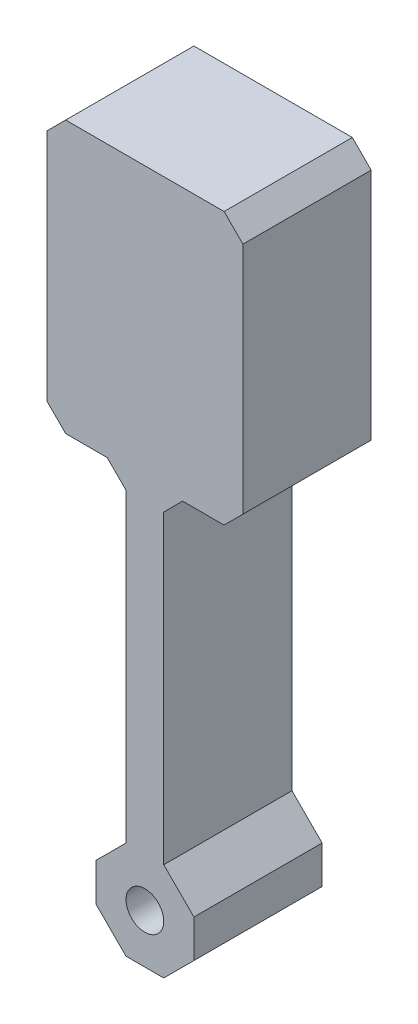
ISO-10303-21;
HEADER;
FILE_DESCRIPTION(('STEP AP214'),'2;1');
FILE_NAME('part.step','',(''),(''),'','','');
FILE_SCHEMA(('AUTOMOTIVE_DESIGN { 1 0 10303 214 1 1 1 1 }'));
ENDSEC;
DATA;
#1=APPLICATION_CONTEXT('core data for automotive mechanical design processes');
#2=APPLICATION_PROTOCOL_DEFINITION('international standard','automotive_design',2000,#1);
#3=PRODUCT_CONTEXT('',#1,'mechanical');
#4=PRODUCT('Part','Part','',(#3));
#5=PRODUCT_RELATED_PRODUCT_CATEGORY('part','',(#4));
#6=PRODUCT_DEFINITION_FORMATION('','',#4);
#7=PRODUCT_DEFINITION_CONTEXT('part definition',#1,'design');
#8=PRODUCT_DEFINITION('design','',#6,#7);
#9=PRODUCT_DEFINITION_SHAPE('','',#8);
#10=(LENGTH_UNIT() NAMED_UNIT(*) SI_UNIT(.MILLI.,.METRE.));
#11=(NAMED_UNIT(*) PLANE_ANGLE_UNIT() SI_UNIT($,.RADIAN.));
#12=(NAMED_UNIT(*) SI_UNIT($,.STERADIAN.) SOLID_ANGLE_UNIT());
#13=UNCERTAINTY_MEASURE_WITH_UNIT(LENGTH_MEASURE(1.E-05),#10,'distance_accuracy_value','');
#14=(GEOMETRIC_REPRESENTATION_CONTEXT(3) GLOBAL_UNCERTAINTY_ASSIGNED_CONTEXT((#13)) GLOBAL_UNIT_ASSIGNED_CONTEXT((#10,
#11,#12)) REPRESENTATION_CONTEXT('',''));
#15=CARTESIAN_POINT('',(0.,0.,0.));
#16=DIRECTION('',(0.,0.,1.));
#17=DIRECTION('',(1.,0.,0.));
#18=AXIS2_PLACEMENT_3D('',#15,#16,#17);
#19=CARTESIAN_POINT('',(-13.,0.,17.));
#20=DIRECTION('',(-1.,0.,0.));
#21=DIRECTION('',(0.,0.,1.));
#22=AXIS2_PLACEMENT_3D('',#19,#20,#21);
#23=PLANE('',#22);
#24=DIRECTION('',(0.,1.,0.));
#25=VECTOR('',#24,1.);
#26=CARTESIAN_POINT('',(-13.,0.,17.));
#27=LINE('',#26,#25);
#28=CARTESIAN_POINT('',(-13.,-20.5,17.));
#29=VERTEX_POINT('',#28);
#30=CARTESIAN_POINT('',(-13.,10.5,17.));
#31=VERTEX_POINT('',#30);
#32=EDGE_CURVE('E276',#29,#31,#27,.T.);
#33=ORIENTED_EDGE('',*,*,#32,.T.);
#34=DIRECTION('',(0.,0.,-1.));
#35=VECTOR('',#34,1.);
#36=CARTESIAN_POINT('',(-13.,10.5,17.));
#37=LINE('',#36,#35);
#38=CARTESIAN_POINT('',(-13.,10.5,0.));
#39=VERTEX_POINT('',#38);
#40=EDGE_CURVE('E291',#31,#39,#37,.T.);
#41=ORIENTED_EDGE('',*,*,#40,.T.);
#42=DIRECTION('',(0.,1.,0.));
#43=VECTOR('',#42,1.);
#44=CARTESIAN_POINT('',(-13.,0.,0.));
#45=LINE('',#44,#43);
#46=CARTESIAN_POINT('',(-13.,-20.5,0.));
#47=VERTEX_POINT('',#46);
#48=EDGE_CURVE('E238',#47,#39,#45,.T.);
#49=ORIENTED_EDGE('',*,*,#48,.F.);
#50=DIRECTION('',(0.,0.,1.));
#51=VECTOR('',#50,1.);
#52=CARTESIAN_POINT('',(-13.,-20.5,17.));
#53=LINE('',#52,#51);
#54=EDGE_CURVE('E192',#47,#29,#53,.T.);
#55=ORIENTED_EDGE('',*,*,#54,.T.);
#56=EDGE_LOOP('',(#33,#41,#49,#55));
#57=FACE_BOUND('',#56,.T.);
#58=ADVANCED_FACE('F41',(#57),#23,.T.);
#59=CARTESIAN_POINT('',(0.,-23.,17.));
#60=DIRECTION('',(0.,1.,0.));
#61=DIRECTION('',(0.,0.,1.));
#62=AXIS2_PLACEMENT_3D('',#59,#60,#61);
#63=PLANE('',#62);
#64=DIRECTION('',(1.,0.,0.));
#65=VECTOR('',#64,1.);
#66=CARTESIAN_POINT('',(0.,-23.,0.));
#67=LINE('',#66,#65);
#68=CARTESIAN_POINT('',(-10.5,-23.,0.));
#69=VERTEX_POINT('',#68);
#70=CARTESIAN_POINT('',(-4.99999999999999,-23.,0.));
#71=VERTEX_POINT('',#70);
#72=EDGE_CURVE('E241',#69,#71,#67,.T.);
#73=ORIENTED_EDGE('',*,*,#72,.T.);
#74=DIRECTION('',(0.,0.,1.));
#75=VECTOR('',#74,1.);
#76=CARTESIAN_POINT('',(-4.99999999999999,-23.,17.));
#77=LINE('',#76,#75);
#78=CARTESIAN_POINT('',(-4.99999999999999,-23.,17.));
#79=VERTEX_POINT('',#78);
#80=EDGE_CURVE('E330',#71,#79,#77,.T.);
#81=ORIENTED_EDGE('',*,*,#80,.T.);
#82=DIRECTION('',(1.,0.,0.));
#83=VECTOR('',#82,1.);
#84=CARTESIAN_POINT('',(0.,-23.,17.));
#85=LINE('',#84,#83);
#86=CARTESIAN_POINT('',(-10.5,-23.,17.));
#87=VERTEX_POINT('',#86);
#88=EDGE_CURVE('E202',#87,#79,#85,.T.);
#89=ORIENTED_EDGE('',*,*,#88,.F.);
#90=DIRECTION('',(0.,0.,-1.));
#91=VECTOR('',#90,1.);
#92=CARTESIAN_POINT('',(-10.5,-23.,0.));
#93=LINE('',#92,#91);
#94=EDGE_CURVE('E327',#87,#69,#93,.T.);
#95=ORIENTED_EDGE('',*,*,#94,.T.);
#96=EDGE_LOOP('',(#73,#81,#89,#95));
#97=FACE_BOUND('',#96,.T.);
#98=ADVANCED_FACE('F342',(#97),#63,.F.);
#99=CARTESIAN_POINT('',(-2.5,0.,17.));
#100=DIRECTION('',(-1.,0.,0.));
#101=DIRECTION('',(0.,-1.,0.));
#102=AXIS2_PLACEMENT_3D('',#99,#100,#101);
#103=PLANE('',#102);
#104=DIRECTION('',(0.,1.,0.));
#105=VECTOR('',#104,1.);
#106=CARTESIAN_POINT('',(-2.5,0.,17.));
#107=LINE('',#106,#105);
#108=CARTESIAN_POINT('',(-2.5,-66.,17.));
#109=VERTEX_POINT('',#108);
#110=CARTESIAN_POINT('',(-2.5,-25.5,17.));
#111=VERTEX_POINT('',#110);
#112=EDGE_CURVE('E184',#109,#111,#107,.T.);
#113=ORIENTED_EDGE('',*,*,#112,.T.);
#114=DIRECTION('',(0.,0.,-1.));
#115=VECTOR('',#114,1.);
#116=CARTESIAN_POINT('',(-2.5,-25.5,17.));
#117=LINE('',#116,#115);
#118=CARTESIAN_POINT('',(-2.5,-25.5,0.));
#119=VERTEX_POINT('',#118);
#120=EDGE_CURVE('E325',#111,#119,#117,.T.);
#121=ORIENTED_EDGE('',*,*,#120,.T.);
#122=DIRECTION('',(0.,1.,0.));
#123=VECTOR('',#122,1.);
#124=CARTESIAN_POINT('',(-2.5,0.,0.));
#125=LINE('',#124,#123);
#126=CARTESIAN_POINT('',(-2.5,-66.,0.));
#127=VERTEX_POINT('',#126);
#128=EDGE_CURVE('E187',#127,#119,#125,.T.);
#129=ORIENTED_EDGE('',*,*,#128,.F.);
#130=DIRECTION('',(0.,0.,-1.));
#131=VECTOR('',#130,1.);
#132=CARTESIAN_POINT('',(-2.5,-66.,17.));
#133=LINE('',#132,#131);
#134=EDGE_CURVE('E180',#109,#127,#133,.T.);
#135=ORIENTED_EDGE('',*,*,#134,.F.);
#136=EDGE_LOOP('',(#113,#121,#129,#135));
#137=FACE_BOUND('',#136,.T.);
#138=ADVANCED_FACE('F182',(#137),#103,.T.);
#139=CARTESIAN_POINT('',(31.75,-31.75,17.));
#140=DIRECTION('',(-0.707106781186547,0.707106781186548,0.));
#141=DIRECTION('',(-0.707106781186548,-0.707106781186547,0.));
#142=AXIS2_PLACEMENT_3D('',#139,#140,#141);
#143=PLANE('',#142);
#144=DIRECTION('',(0.707106781186548,0.707106781186547,0.));
#145=VECTOR('',#144,1.);
#146=CARTESIAN_POINT('',(31.75,-31.75,0.));
#147=LINE('',#146,#145);
#148=CARTESIAN_POINT('',(-6.50000000000001,-70.,0.));
#149=VERTEX_POINT('',#148);
#150=EDGE_CURVE('E246',#149,#127,#147,.T.);
#151=ORIENTED_EDGE('',*,*,#150,.F.);
#152=DIRECTION('',(0.,0.,-1.));
#153=VECTOR('',#152,1.);
#154=CARTESIAN_POINT('',(-6.50000000000001,-70.,17.));
#155=LINE('',#154,#153);
#156=CARTESIAN_POINT('',(-6.50000000000001,-70.,17.));
#157=VERTEX_POINT('',#156);
#158=EDGE_CURVE('E193',#157,#149,#155,.T.);
#159=ORIENTED_EDGE('',*,*,#158,.F.);
#160=DIRECTION('',(0.707106781186548,0.707106781186547,0.));
#161=VECTOR('',#160,1.);
#162=CARTESIAN_POINT('',(31.75,-31.75,17.));
#163=LINE('',#162,#161);
#164=EDGE_CURVE('E199',#157,#109,#163,.T.);
#165=ORIENTED_EDGE('',*,*,#164,.T.);
#166=ORIENTED_EDGE('',*,*,#134,.T.);
#167=EDGE_LOOP('',(#151,#159,#165,#166));
#168=FACE_BOUND('',#167,.T.);
#169=ADVANCED_FACE('F204',(#168),#143,.T.);
#170=CARTESIAN_POINT('',(-6.50000000000002,0.,17.));
#171=DIRECTION('',(1.,0.,0.));
#172=DIRECTION('',(0.,1.,0.));
#173=AXIS2_PLACEMENT_3D('',#170,#171,#172);
#174=PLANE('',#173);
#175=DIRECTION('',(0.,-1.,0.));
#176=VECTOR('',#175,1.);
#177=CARTESIAN_POINT('',(-6.50000000000002,0.,0.));
#178=LINE('',#177,#176);
#179=CARTESIAN_POINT('',(-6.50000000000001,-75.,0.));
#180=VERTEX_POINT('',#179);
#181=EDGE_CURVE('E248',#149,#180,#178,.T.);
#182=ORIENTED_EDGE('',*,*,#181,.T.);
#183=DIRECTION('',(0.,0.,-1.));
#184=VECTOR('',#183,1.);
#185=CARTESIAN_POINT('',(-6.50000000000001,-75.,17.));
#186=LINE('',#185,#184);
#187=CARTESIAN_POINT('',(-6.50000000000001,-75.,17.));
#188=VERTEX_POINT('',#187);
#189=EDGE_CURVE('E287',#188,#180,#186,.T.);
#190=ORIENTED_EDGE('',*,*,#189,.F.);
#191=DIRECTION('',(0.,-1.,0.));
#192=VECTOR('',#191,1.);
#193=CARTESIAN_POINT('',(-6.50000000000002,0.,17.));
#194=LINE('',#193,#192);
#195=EDGE_CURVE('E206',#157,#188,#194,.T.);
#196=ORIENTED_EDGE('',*,*,#195,.F.);
#197=ORIENTED_EDGE('',*,*,#158,.T.);
#198=EDGE_LOOP('',(#182,#190,#196,#197));
#199=FACE_BOUND('',#198,.T.);
#200=ADVANCED_FACE('F449',(#199),#174,.F.);
#201=CARTESIAN_POINT('',(-40.75,-40.7500000000001,17.));
#202=DIRECTION('',(-0.707106781186547,-0.707106781186548,0.));
#203=DIRECTION('',(0.707106781186548,-0.707106781186547,0.));
#204=AXIS2_PLACEMENT_3D('',#201,#202,#203);
#205=PLANE('',#204);
#206=DIRECTION('',(-0.707106781186548,0.707106781186547,0.));
#207=VECTOR('',#206,1.);
#208=CARTESIAN_POINT('',(-40.75,-40.7500000000001,0.));
#209=LINE('',#208,#207);
#210=CARTESIAN_POINT('',(-2.5,-79.,0.));
#211=VERTEX_POINT('',#210);
#212=EDGE_CURVE('E251',#211,#180,#209,.T.);
#213=ORIENTED_EDGE('',*,*,#212,.F.);
#214=DIRECTION('',(0.,0.,-1.));
#215=VECTOR('',#214,1.);
#216=CARTESIAN_POINT('',(-2.5,-79.,17.));
#217=LINE('',#216,#215);
#218=CARTESIAN_POINT('',(-2.5,-79.,17.));
#219=VERTEX_POINT('',#218);
#220=EDGE_CURVE('E285',#219,#211,#217,.T.);
#221=ORIENTED_EDGE('',*,*,#220,.F.);
#222=DIRECTION('',(-0.707106781186548,0.707106781186547,0.));
#223=VECTOR('',#222,1.);
#224=CARTESIAN_POINT('',(-40.75,-40.7500000000001,17.));
#225=LINE('',#224,#223);
#226=EDGE_CURVE('E208',#219,#188,#225,.T.);
#227=ORIENTED_EDGE('',*,*,#226,.T.);
#228=ORIENTED_EDGE('',*,*,#189,.T.);
#229=EDGE_LOOP('',(#213,#221,#227,#228));
#230=FACE_BOUND('',#229,.T.);
#231=ADVANCED_FACE('F446',(#230),#205,.T.);
#232=CARTESIAN_POINT('',(0.,-79.,17.));
#233=DIRECTION('',(0.,-1.,0.));
#234=DIRECTION('',(0.,0.,-1.));
#235=AXIS2_PLACEMENT_3D('',#232,#233,#234);
#236=PLANE('',#235);
#237=DIRECTION('',(-1.,0.,0.));
#238=VECTOR('',#237,1.);
#239=CARTESIAN_POINT('',(0.,-79.,0.));
#240=LINE('',#239,#238);
#241=CARTESIAN_POINT('',(2.5,-79.,0.));
#242=VERTEX_POINT('',#241);
#243=EDGE_CURVE('E254',#242,#211,#240,.T.);
#244=ORIENTED_EDGE('',*,*,#243,.F.);
#245=DIRECTION('',(0.,0.,-1.));
#246=VECTOR('',#245,1.);
#247=CARTESIAN_POINT('',(2.5,-79.,17.));
#248=LINE('',#247,#246);
#249=CARTESIAN_POINT('',(2.5,-79.,17.));
#250=VERTEX_POINT('',#249);
#251=EDGE_CURVE('E283',#250,#242,#248,.T.);
#252=ORIENTED_EDGE('',*,*,#251,.F.);
#253=DIRECTION('',(-1.,0.,0.));
#254=VECTOR('',#253,1.);
#255=CARTESIAN_POINT('',(0.,-79.,17.));
#256=LINE('',#255,#254);
#257=EDGE_CURVE('E214',#250,#219,#256,.T.);
#258=ORIENTED_EDGE('',*,*,#257,.T.);
#259=ORIENTED_EDGE('',*,*,#220,.T.);
#260=EDGE_LOOP('',(#244,#252,#258,#259));
#261=FACE_BOUND('',#260,.T.);
#262=ADVANCED_FACE('F442',(#261),#236,.T.);
#263=CARTESIAN_POINT('',(40.75,-40.7499999999999,17.));
#264=DIRECTION('',(0.707106781186549,-0.707106781186546,0.));
#265=DIRECTION('',(0.707106781186546,0.707106781186549,0.));
#266=AXIS2_PLACEMENT_3D('',#263,#264,#265);
#267=PLANE('',#266);
#268=DIRECTION('',(-0.707106781186546,-0.707106781186549,0.));
#269=VECTOR('',#268,1.);
#270=CARTESIAN_POINT('',(40.75,-40.7499999999999,0.));
#271=LINE('',#270,#269);
#272=CARTESIAN_POINT('',(6.5,-75.,0.));
#273=VERTEX_POINT('',#272);
#274=EDGE_CURVE('E257',#273,#242,#271,.T.);
#275=ORIENTED_EDGE('',*,*,#274,.F.);
#276=DIRECTION('',(0.,0.,-1.));
#277=VECTOR('',#276,1.);
#278=CARTESIAN_POINT('',(6.5,-75.,17.));
#279=LINE('',#278,#277);
#280=CARTESIAN_POINT('',(6.5,-75.,17.));
#281=VERTEX_POINT('',#280);
#282=EDGE_CURVE('E281',#281,#273,#279,.T.);
#283=ORIENTED_EDGE('',*,*,#282,.F.);
#284=DIRECTION('',(-0.707106781186546,-0.707106781186549,0.));
#285=VECTOR('',#284,1.);
#286=CARTESIAN_POINT('',(40.75,-40.7499999999999,17.));
#287=LINE('',#286,#285);
#288=EDGE_CURVE('E217',#281,#250,#287,.T.);
#289=ORIENTED_EDGE('',*,*,#288,.T.);
#290=ORIENTED_EDGE('',*,*,#251,.T.);
#291=EDGE_LOOP('',(#275,#283,#289,#290));
#292=FACE_BOUND('',#291,.T.);
#293=ADVANCED_FACE('F437',(#292),#267,.T.);
#294=CARTESIAN_POINT('',(6.49999999999998,0.,17.));
#295=DIRECTION('',(1.,0.,0.));
#296=DIRECTION('',(0.,1.,0.));
#297=AXIS2_PLACEMENT_3D('',#294,#295,#296);
#298=PLANE('',#297);
#299=DIRECTION('',(0.,-1.,0.));
#300=VECTOR('',#299,1.);
#301=CARTESIAN_POINT('',(6.49999999999998,0.,0.));
#302=LINE('',#301,#300);
#303=CARTESIAN_POINT('',(6.49999999999999,-70.,0.));
#304=VERTEX_POINT('',#303);
#305=EDGE_CURVE('E260',#304,#273,#302,.T.);
#306=ORIENTED_EDGE('',*,*,#305,.F.);
#307=DIRECTION('',(0.,0.,-1.));
#308=VECTOR('',#307,1.);
#309=CARTESIAN_POINT('',(6.49999999999999,-70.,17.));
#310=LINE('',#309,#308);
#311=CARTESIAN_POINT('',(6.49999999999999,-70.,17.));
#312=VERTEX_POINT('',#311);
#313=EDGE_CURVE('E279',#312,#304,#310,.T.);
#314=ORIENTED_EDGE('',*,*,#313,.F.);
#315=DIRECTION('',(0.,-1.,0.));
#316=VECTOR('',#315,1.);
#317=CARTESIAN_POINT('',(6.49999999999998,0.,17.));
#318=LINE('',#317,#316);
#319=EDGE_CURVE('E220',#312,#281,#318,.T.);
#320=ORIENTED_EDGE('',*,*,#319,.T.);
#321=ORIENTED_EDGE('',*,*,#282,.T.);
#322=EDGE_LOOP('',(#306,#314,#320,#321));
#323=FACE_BOUND('',#322,.T.);
#324=ADVANCED_FACE('F432',(#323),#298,.T.);
#325=CARTESIAN_POINT('',(-31.75,-31.75,17.));
#326=DIRECTION('',(-0.707106781186548,-0.707106781186547,0.));
#327=DIRECTION('',(0.707106781186547,-0.707106781186548,0.));
#328=AXIS2_PLACEMENT_3D('',#325,#326,#327);
#329=PLANE('',#328);
#330=DIRECTION('',(-0.707106781186547,0.707106781186548,0.));
#331=VECTOR('',#330,1.);
#332=CARTESIAN_POINT('',(-31.75,-31.75,0.));
#333=LINE('',#332,#331);
#334=CARTESIAN_POINT('',(2.49999999999999,-66.,0.));
#335=VERTEX_POINT('',#334);
#336=EDGE_CURVE('E263',#304,#335,#333,.T.);
#337=ORIENTED_EDGE('',*,*,#336,.T.);
#338=DIRECTION('',(0.,0.,-1.));
#339=VECTOR('',#338,1.);
#340=CARTESIAN_POINT('',(2.49999999999999,-66.,17.));
#341=LINE('',#340,#339);
#342=CARTESIAN_POINT('',(2.49999999999999,-66.,17.));
#343=VERTEX_POINT('',#342);
#344=EDGE_CURVE('E237',#343,#335,#341,.T.);
#345=ORIENTED_EDGE('',*,*,#344,.F.);
#346=DIRECTION('',(-0.707106781186547,0.707106781186548,0.));
#347=VECTOR('',#346,1.);
#348=CARTESIAN_POINT('',(-31.75,-31.75,17.));
#349=LINE('',#348,#347);
#350=EDGE_CURVE('E223',#312,#343,#349,.T.);
#351=ORIENTED_EDGE('',*,*,#350,.F.);
#352=ORIENTED_EDGE('',*,*,#313,.T.);
#353=EDGE_LOOP('',(#337,#345,#351,#352));
#354=FACE_BOUND('',#353,.T.);
#355=ADVANCED_FACE('F429',(#354),#329,.F.);
#356=CARTESIAN_POINT('',(2.49999999999999,0.,17.));
#357=DIRECTION('',(1.,0.,0.));
#358=DIRECTION('',(0.,0.,-1.));
#359=AXIS2_PLACEMENT_3D('',#356,#357,#358);
#360=PLANE('',#359);
#361=DIRECTION('',(0.,-1.,0.));
#362=VECTOR('',#361,1.);
#363=CARTESIAN_POINT('',(2.49999999999999,0.,0.));
#364=LINE('',#363,#362);
#365=CARTESIAN_POINT('',(2.49999999999999,-25.5,0.));
#366=VERTEX_POINT('',#365);
#367=EDGE_CURVE('E266',#366,#335,#364,.T.);
#368=ORIENTED_EDGE('',*,*,#367,.F.);
#369=DIRECTION('',(0.,0.,1.));
#370=VECTOR('',#369,1.);
#371=CARTESIAN_POINT('',(2.49999999999999,-25.5,17.));
#372=LINE('',#371,#370);
#373=CARTESIAN_POINT('',(2.49999999999999,-25.5,17.));
#374=VERTEX_POINT('',#373);
#375=EDGE_CURVE('E323',#366,#374,#372,.T.);
#376=ORIENTED_EDGE('',*,*,#375,.T.);
#377=DIRECTION('',(0.,-1.,0.));
#378=VECTOR('',#377,1.);
#379=CARTESIAN_POINT('',(2.49999999999999,0.,17.));
#380=LINE('',#379,#378);
#381=EDGE_CURVE('E226',#374,#343,#380,.T.);
#382=ORIENTED_EDGE('',*,*,#381,.T.);
#383=ORIENTED_EDGE('',*,*,#344,.T.);
#384=EDGE_LOOP('',(#368,#376,#382,#383));
#385=FACE_BOUND('',#384,.T.);
#386=ADVANCED_FACE('F425',(#385),#360,.T.);
#387=CARTESIAN_POINT('',(5.00000000000001,-23.,0.));
#388=VERTEX_POINT('',#387);
#389=CARTESIAN_POINT('',(10.5,-23.,0.));
#390=VERTEX_POINT('',#389);
#391=EDGE_CURVE('E244',#388,#390,#67,.T.);
#392=ORIENTED_EDGE('',*,*,#391,.T.);
#393=DIRECTION('',(0.,0.,1.));
#394=VECTOR('',#393,1.);
#395=CARTESIAN_POINT('',(10.5,-23.,17.));
#396=LINE('',#395,#394);
#397=CARTESIAN_POINT('',(10.5,-23.,17.));
#398=VERTEX_POINT('',#397);
#399=EDGE_CURVE('E321',#390,#398,#396,.T.);
#400=ORIENTED_EDGE('',*,*,#399,.T.);
#401=CARTESIAN_POINT('',(5.00000000000001,-23.,17.));
#402=VERTEX_POINT('',#401);
#403=EDGE_CURVE('E228',#402,#398,#85,.T.);
#404=ORIENTED_EDGE('',*,*,#403,.F.);
#405=DIRECTION('',(0.,0.,-1.));
#406=VECTOR('',#405,1.);
#407=CARTESIAN_POINT('',(5.00000000000001,-23.,17.));
#408=LINE('',#407,#406);
#409=EDGE_CURVE('E318',#402,#388,#408,.T.);
#410=ORIENTED_EDGE('',*,*,#409,.T.);
#411=EDGE_LOOP('',(#392,#400,#404,#410));
#412=FACE_BOUND('',#411,.T.);
#413=ADVANCED_FACE('F364',(#412),#63,.F.);
#414=CARTESIAN_POINT('',(13.,0.,17.));
#415=DIRECTION('',(-1.,0.,0.));
#416=DIRECTION('',(0.,0.,1.));
#417=AXIS2_PLACEMENT_3D('',#414,#415,#416);
#418=PLANE('',#417);
#419=DIRECTION('',(0.,1.,0.));
#420=VECTOR('',#419,1.);
#421=CARTESIAN_POINT('',(13.,0.,0.));
#422=LINE('',#421,#420);
#423=CARTESIAN_POINT('',(13.,-20.5,0.));
#424=VERTEX_POINT('',#423);
#425=CARTESIAN_POINT('',(13.,10.5,0.));
#426=VERTEX_POINT('',#425);
#427=EDGE_CURVE('E268',#424,#426,#422,.T.);
#428=ORIENTED_EDGE('',*,*,#427,.T.);
#429=DIRECTION('',(0.,0.,1.));
#430=VECTOR('',#429,1.);
#431=CARTESIAN_POINT('',(13.,10.5,17.));
#432=LINE('',#431,#430);
#433=CARTESIAN_POINT('',(13.,10.5,17.));
#434=VERTEX_POINT('',#433);
#435=EDGE_CURVE('E57',#426,#434,#432,.T.);
#436=ORIENTED_EDGE('',*,*,#435,.T.);
#437=DIRECTION('',(0.,1.,0.));
#438=VECTOR('',#437,1.);
#439=CARTESIAN_POINT('',(13.,0.,17.));
#440=LINE('',#439,#438);
#441=CARTESIAN_POINT('',(13.,-20.5,17.));
#442=VERTEX_POINT('',#441);
#443=EDGE_CURVE('E229',#442,#434,#440,.T.);
#444=ORIENTED_EDGE('',*,*,#443,.F.);
#445=DIRECTION('',(0.,0.,-1.));
#446=VECTOR('',#445,1.);
#447=CARTESIAN_POINT('',(13.,-20.5,17.));
#448=LINE('',#447,#446);
#449=EDGE_CURVE('E314',#442,#424,#448,.T.);
#450=ORIENTED_EDGE('',*,*,#449,.T.);
#451=EDGE_LOOP('',(#428,#436,#444,#450));
#452=FACE_BOUND('',#451,.T.);
#453=ADVANCED_FACE('F400',(#452),#418,.F.);
#454=CARTESIAN_POINT('',(0.,13.,17.));
#455=DIRECTION('',(0.,1.,0.));
#456=DIRECTION('',(0.,0.,1.));
#457=AXIS2_PLACEMENT_3D('',#454,#455,#456);
#458=PLANE('',#457);
#459=DIRECTION('',(1.,0.,0.));
#460=VECTOR('',#459,1.);
#461=CARTESIAN_POINT('',(0.,13.,0.));
#462=LINE('',#461,#460);
#463=CARTESIAN_POINT('',(-10.5,13.,0.));
#464=VERTEX_POINT('',#463);
#465=CARTESIAN_POINT('',(10.5,13.,0.));
#466=VERTEX_POINT('',#465);
#467=EDGE_CURVE('E270',#464,#466,#462,.T.);
#468=ORIENTED_EDGE('',*,*,#467,.F.);
#469=DIRECTION('',(0.,0.,1.));
#470=VECTOR('',#469,1.);
#471=CARTESIAN_POINT('',(-10.5,13.,17.));
#472=LINE('',#471,#470);
#473=CARTESIAN_POINT('',(-10.5,13.,17.));
#474=VERTEX_POINT('',#473);
#475=EDGE_CURVE('E305',#464,#474,#472,.T.);
#476=ORIENTED_EDGE('',*,*,#475,.T.);
#477=DIRECTION('',(1.,0.,0.));
#478=VECTOR('',#477,1.);
#479=CARTESIAN_POINT('',(0.,13.,17.));
#480=LINE('',#479,#478);
#481=CARTESIAN_POINT('',(10.5,13.,17.));
#482=VERTEX_POINT('',#481);
#483=EDGE_CURVE('E231',#474,#482,#480,.T.);
#484=ORIENTED_EDGE('',*,*,#483,.T.);
#485=DIRECTION('',(0.,0.,-1.));
#486=VECTOR('',#485,1.);
#487=CARTESIAN_POINT('',(10.5,13.,0.));
#488=LINE('',#487,#486);
#489=EDGE_CURVE('E302',#482,#466,#488,.T.);
#490=ORIENTED_EDGE('',*,*,#489,.T.);
#491=EDGE_LOOP('',(#468,#476,#484,#490));
#492=FACE_BOUND('',#491,.T.);
#493=ADVANCED_FACE('F407',(#492),#458,.T.);
#494=CARTESIAN_POINT('',(0.,-72.5,17.));
#495=DIRECTION('',(0.,0.,-1.));
#496=DIRECTION('',(-1.,0.,0.));
#497=AXIS2_PLACEMENT_3D('',#494,#495,#496);
#498=CYLINDRICAL_SURFACE('',#497,2.5);
#499=CARTESIAN_POINT('',(0.,-72.5,17.));
#500=DIRECTION('',(0.,0.,1.));
#501=DIRECTION('',(1.,0.,0.));
#502=AXIS2_PLACEMENT_3D('',#499,#500,#501);
#503=CIRCLE('',#502,2.5);
#504=CARTESIAN_POINT('',(2.50000000000001,-72.5,17.));
#505=VERTEX_POINT('',#504);
#506=EDGE_CURVE('E234',#505,#505,#503,.T.);
#507=ORIENTED_EDGE('',*,*,#506,.T.);
#508=EDGE_LOOP('',(#507));
#509=FACE_BOUND('',#508,.T.);
#510=CARTESIAN_POINT('',(0.,-72.5,0.));
#511=DIRECTION('',(0.,0.,1.));
#512=DIRECTION('',(1.,0.,0.));
#513=AXIS2_PLACEMENT_3D('',#510,#511,#512);
#514=CIRCLE('',#513,2.5);
#515=CARTESIAN_POINT('',(2.50000000000001,-72.5,0.));
#516=VERTEX_POINT('',#515);
#517=EDGE_CURVE('E273',#516,#516,#514,.T.);
#518=ORIENTED_EDGE('',*,*,#517,.F.);
#519=EDGE_LOOP('',(#518));
#520=FACE_BOUND('',#519,.T.);
#521=ADVANCED_FACE('F473',(#509,#520),#498,.F.);
#522=CARTESIAN_POINT('',(0.,0.,17.));
#523=DIRECTION('',(0.,0.,1.));
#524=DIRECTION('',(1.,0.,0.));
#525=AXIS2_PLACEMENT_3D('',#522,#523,#524);
#526=PLANE('',#525);
#527=ORIENTED_EDGE('',*,*,#483,.F.);
#528=DIRECTION('',(0.707106781186549,0.707106781186546,0.));
#529=VECTOR('',#528,1.);
#530=CARTESIAN_POINT('',(-11.75,11.75,17.));
#531=LINE('',#530,#529);
#532=EDGE_CURVE('E312',#474,#31,#531,.F.);
#533=ORIENTED_EDGE('',*,*,#532,.T.);
#534=ORIENTED_EDGE('',*,*,#32,.F.);
#535=DIRECTION('',(0.707106781186546,-0.707106781186549,0.));
#536=VECTOR('',#535,1.);
#537=CARTESIAN_POINT('',(-16.75,-16.7499999999999,17.));
#538=LINE('',#537,#536);
#539=EDGE_CURVE('E307',#29,#87,#538,.T.);
#540=ORIENTED_EDGE('',*,*,#539,.T.);
#541=ORIENTED_EDGE('',*,*,#88,.T.);
#542=DIRECTION('',(0.707106781186544,-0.707106781186551,0.));
#543=VECTOR('',#542,1.);
#544=CARTESIAN_POINT('',(-2.5,-25.5,17.));
#545=LINE('',#544,#543);
#546=EDGE_CURVE('E11',#79,#111,#545,.T.);
#547=ORIENTED_EDGE('',*,*,#546,.T.);
#548=ORIENTED_EDGE('',*,*,#112,.F.);
#549=ORIENTED_EDGE('',*,*,#164,.F.);
#550=ORIENTED_EDGE('',*,*,#195,.T.);
#551=ORIENTED_EDGE('',*,*,#226,.F.);
#552=ORIENTED_EDGE('',*,*,#257,.F.);
#553=ORIENTED_EDGE('',*,*,#288,.F.);
#554=ORIENTED_EDGE('',*,*,#319,.F.);
#555=ORIENTED_EDGE('',*,*,#350,.T.);
#556=ORIENTED_EDGE('',*,*,#381,.F.);
#557=DIRECTION('',(0.707106781186552,0.707106781186544,0.));
#558=VECTOR('',#557,1.);
#559=CARTESIAN_POINT('',(5.00000000000001,-23.,17.));
#560=LINE('',#559,#558);
#561=EDGE_CURVE('E334',#374,#402,#560,.T.);
#562=ORIENTED_EDGE('',*,*,#561,.T.);
#563=ORIENTED_EDGE('',*,*,#403,.T.);
#564=DIRECTION('',(-0.707106781186549,-0.707106781186546,0.));
#565=VECTOR('',#564,1.);
#566=CARTESIAN_POINT('',(16.75,-16.7500000000001,17.));
#567=LINE('',#566,#565);
#568=EDGE_CURVE('E64',#398,#442,#567,.F.);
#569=ORIENTED_EDGE('',*,*,#568,.T.);
#570=ORIENTED_EDGE('',*,*,#443,.T.);
#571=DIRECTION('',(-0.707106781186546,0.707106781186549,0.));
#572=VECTOR('',#571,1.);
#573=CARTESIAN_POINT('',(11.75,11.75,17.));
#574=LINE('',#573,#572);
#575=EDGE_CURVE('E310',#434,#482,#574,.T.);
#576=ORIENTED_EDGE('',*,*,#575,.T.);
#577=EDGE_LOOP('',(#527,#533,#534,#540,#541,#547,#548,#549,#550,#551,#552,#553,#554,#555,#556,
#562,#563,#569,#570,#576));
#578=FACE_BOUND('',#577,.T.);
#579=ORIENTED_EDGE('',*,*,#506,.F.);
#580=EDGE_LOOP('',(#579));
#581=FACE_BOUND('',#580,.T.);
#582=ADVANCED_FACE('F197',(#578,#581),#526,.T.);
#583=CARTESIAN_POINT('',(0.,0.,0.));
#584=DIRECTION('',(0.,0.,1.));
#585=DIRECTION('',(1.,0.,0.));
#586=AXIS2_PLACEMENT_3D('',#583,#584,#585);
#587=PLANE('',#586);
#588=ORIENTED_EDGE('',*,*,#48,.T.);
#589=DIRECTION('',(-0.707106781186549,-0.707106781186546,0.));
#590=VECTOR('',#589,1.);
#591=CARTESIAN_POINT('',(-13.,10.5,0.));
#592=LINE('',#591,#590);
#593=EDGE_CURVE('E300',#39,#464,#592,.F.);
#594=ORIENTED_EDGE('',*,*,#593,.T.);
#595=ORIENTED_EDGE('',*,*,#467,.T.);
#596=DIRECTION('',(0.707106781186546,-0.707106781186549,0.));
#597=VECTOR('',#596,1.);
#598=CARTESIAN_POINT('',(10.5,13.,0.));
#599=LINE('',#598,#597);
#600=EDGE_CURVE('E298',#466,#426,#599,.T.);
#601=ORIENTED_EDGE('',*,*,#600,.T.);
#602=ORIENTED_EDGE('',*,*,#427,.F.);
#603=DIRECTION('',(0.707106781186549,0.707106781186546,0.));
#604=VECTOR('',#603,1.);
#605=CARTESIAN_POINT('',(13.,-20.5,0.));
#606=LINE('',#605,#604);
#607=EDGE_CURVE('E296',#424,#390,#606,.F.);
#608=ORIENTED_EDGE('',*,*,#607,.T.);
#609=ORIENTED_EDGE('',*,*,#391,.F.);
#610=DIRECTION('',(-0.707106781186552,-0.707106781186544,0.));
#611=VECTOR('',#610,1.);
#612=CARTESIAN_POINT('',(14.,-14.0000000000001,0.));
#613=LINE('',#612,#611);
#614=EDGE_CURVE('E332',#388,#366,#613,.T.);
#615=ORIENTED_EDGE('',*,*,#614,.T.);
#616=ORIENTED_EDGE('',*,*,#367,.T.);
#617=ORIENTED_EDGE('',*,*,#336,.F.);
#618=ORIENTED_EDGE('',*,*,#305,.T.);
#619=ORIENTED_EDGE('',*,*,#274,.T.);
#620=ORIENTED_EDGE('',*,*,#243,.T.);
#621=ORIENTED_EDGE('',*,*,#212,.T.);
#622=ORIENTED_EDGE('',*,*,#181,.F.);
#623=ORIENTED_EDGE('',*,*,#150,.T.);
#624=ORIENTED_EDGE('',*,*,#128,.T.);
#625=DIRECTION('',(-0.707106781186544,0.707106781186551,0.));
#626=VECTOR('',#625,1.);
#627=CARTESIAN_POINT('',(-14.,-13.9999999999999,0.));
#628=LINE('',#627,#626);
#629=EDGE_CURVE('E50',#119,#71,#628,.T.);
#630=ORIENTED_EDGE('',*,*,#629,.T.);
#631=ORIENTED_EDGE('',*,*,#72,.F.);
#632=DIRECTION('',(-0.707106781186546,0.707106781186549,0.));
#633=VECTOR('',#632,1.);
#634=CARTESIAN_POINT('',(-10.5,-23.,0.));
#635=LINE('',#634,#633);
#636=EDGE_CURVE('E294',#69,#47,#635,.T.);
#637=ORIENTED_EDGE('',*,*,#636,.T.);
#638=EDGE_LOOP('',(#588,#594,#595,#601,#602,#608,#609,#615,#616,#617,#618,#619,#620,#621,#622,
#623,#624,#630,#631,#637));
#639=FACE_BOUND('',#638,.T.);
#640=ORIENTED_EDGE('',*,*,#517,.T.);
#641=EDGE_LOOP('',(#640));
#642=FACE_BOUND('',#641,.T.);
#643=ADVANCED_FACE('F337',(#639,#642),#587,.F.);
#644=CARTESIAN_POINT('',(-13.,10.5,17.));
#645=DIRECTION('',(0.707106781186546,-0.707106781186549,0.));
#646=DIRECTION('',(0.,0.,-1.));
#647=AXIS2_PLACEMENT_3D('',#644,#645,#646);
#648=PLANE('',#647);
#649=ORIENTED_EDGE('',*,*,#532,.F.);
#650=ORIENTED_EDGE('',*,*,#475,.F.);
#651=ORIENTED_EDGE('',*,*,#593,.F.);
#652=ORIENTED_EDGE('',*,*,#40,.F.);
#653=EDGE_LOOP('',(#649,#650,#651,#652));
#654=FACE_BOUND('',#653,.T.);
#655=ADVANCED_FACE('F370',(#654),#648,.F.);
#656=CARTESIAN_POINT('',(10.5,13.,17.));
#657=DIRECTION('',(0.707106781186549,0.707106781186546,0.));
#658=DIRECTION('',(0.,0.,1.));
#659=AXIS2_PLACEMENT_3D('',#656,#657,#658);
#660=PLANE('',#659);
#661=ORIENTED_EDGE('',*,*,#575,.F.);
#662=ORIENTED_EDGE('',*,*,#435,.F.);
#663=ORIENTED_EDGE('',*,*,#600,.F.);
#664=ORIENTED_EDGE('',*,*,#489,.F.);
#665=EDGE_LOOP('',(#661,#662,#663,#664));
#666=FACE_BOUND('',#665,.T.);
#667=ADVANCED_FACE('F376',(#666),#660,.T.);
#668=CARTESIAN_POINT('',(13.,-20.5,17.));
#669=DIRECTION('',(-0.707106781186546,0.707106781186549,0.));
#670=DIRECTION('',(0.,0.,-1.));
#671=AXIS2_PLACEMENT_3D('',#668,#669,#670);
#672=PLANE('',#671);
#673=ORIENTED_EDGE('',*,*,#568,.F.);
#674=ORIENTED_EDGE('',*,*,#399,.F.);
#675=ORIENTED_EDGE('',*,*,#607,.F.);
#676=ORIENTED_EDGE('',*,*,#449,.F.);
#677=EDGE_LOOP('',(#673,#674,#675,#676));
#678=FACE_BOUND('',#677,.T.);
#679=ADVANCED_FACE('F353',(#678),#672,.F.);
#680=CARTESIAN_POINT('',(5.00000000000001,-23.,17.));
#681=DIRECTION('',(-0.707106781186544,0.707106781186552,0.));
#682=DIRECTION('',(0.,0.,-1.));
#683=AXIS2_PLACEMENT_3D('',#680,#681,#682);
#684=PLANE('',#683);
#685=ORIENTED_EDGE('',*,*,#561,.F.);
#686=ORIENTED_EDGE('',*,*,#375,.F.);
#687=ORIENTED_EDGE('',*,*,#614,.F.);
#688=ORIENTED_EDGE('',*,*,#409,.F.);
#689=EDGE_LOOP('',(#685,#686,#687,#688));
#690=FACE_BOUND('',#689,.T.);
#691=ADVANCED_FACE('F347',(#690),#684,.F.);
#692=CARTESIAN_POINT('',(-2.5,-25.5,17.));
#693=DIRECTION('',(0.707106781186551,0.707106781186544,0.));
#694=DIRECTION('',(0.,0.,-1.));
#695=AXIS2_PLACEMENT_3D('',#692,#693,#694);
#696=PLANE('',#695);
#697=ORIENTED_EDGE('',*,*,#546,.F.);
#698=ORIENTED_EDGE('',*,*,#80,.F.);
#699=ORIENTED_EDGE('',*,*,#629,.F.);
#700=ORIENTED_EDGE('',*,*,#120,.F.);
#701=EDGE_LOOP('',(#697,#698,#699,#700));
#702=FACE_BOUND('',#701,.T.);
#703=ADVANCED_FACE('F345',(#702),#696,.F.);
#704=CARTESIAN_POINT('',(-10.5,-23.,17.));
#705=DIRECTION('',(-0.707106781186549,-0.707106781186545,0.));
#706=DIRECTION('',(0.,0.,1.));
#707=AXIS2_PLACEMENT_3D('',#704,#705,#706);
#708=PLANE('',#707);
#709=ORIENTED_EDGE('',*,*,#539,.F.);
#710=ORIENTED_EDGE('',*,*,#54,.F.);
#711=ORIENTED_EDGE('',*,*,#636,.F.);
#712=ORIENTED_EDGE('',*,*,#94,.F.);
#713=EDGE_LOOP('',(#709,#710,#711,#712));
#714=FACE_BOUND('',#713,.T.);
#715=ADVANCED_FACE('F44',(#714),#708,.T.);
#716=CLOSED_SHELL('',(#58,#98,#138,#169,#200,#231,#262,#293,#324,#355,#386,#413,#453,#493,#521,
#582,#643,#655,#667,#679,#691,#703,#715));
#717=MANIFOLD_SOLID_BREP('B2',#716);
#718=ADVANCED_BREP_SHAPE_REPRESENTATION('',(#18,#717),#14);
#719=SHAPE_DEFINITION_REPRESENTATION(#9,#718);
ENDSEC;
END-ISO-10303-21;
